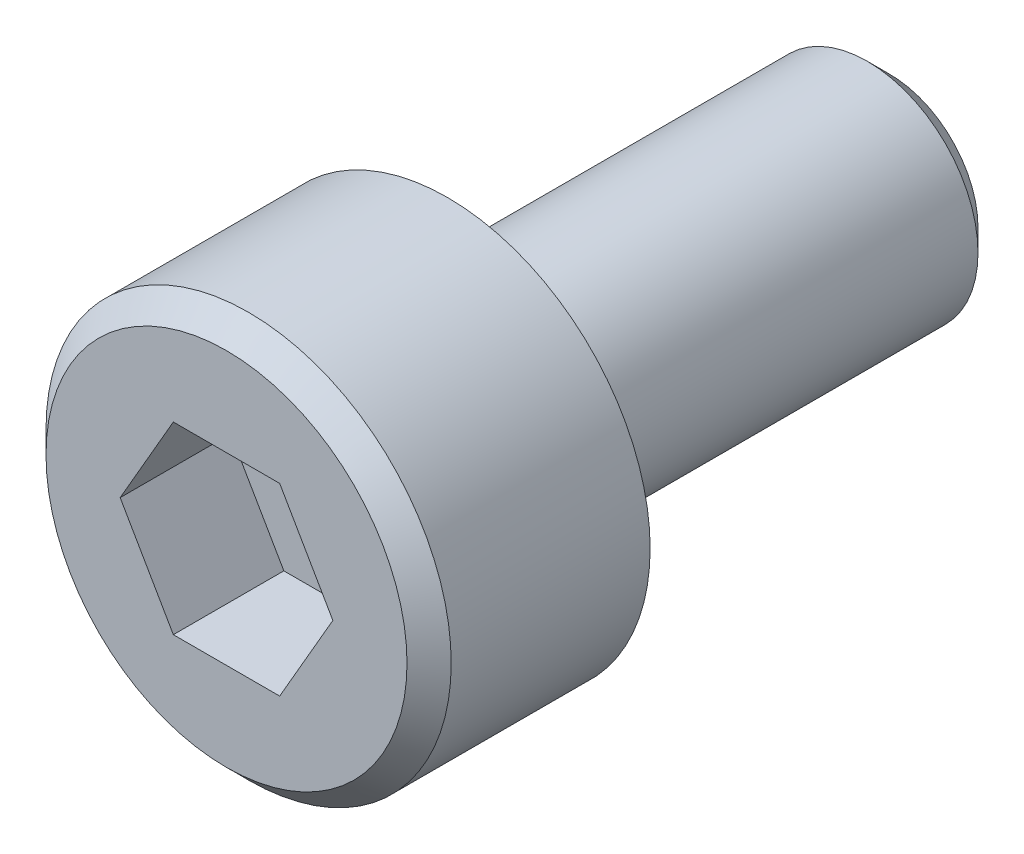
ISO-10303-21;
HEADER;
FILE_DESCRIPTION(('STEP AP214'),'2;1');
FILE_NAME('part.step','',(''),(''),'','','');
FILE_SCHEMA(('AUTOMOTIVE_DESIGN { 1 0 10303 214 1 1 1 1 }'));
ENDSEC;
DATA;
#1=APPLICATION_CONTEXT('core data for automotive mechanical design processes');
#2=APPLICATION_PROTOCOL_DEFINITION('international standard','automotive_design',2000,#1);
#3=PRODUCT_CONTEXT('',#1,'mechanical');
#4=PRODUCT('Part','Part','',(#3));
#5=PRODUCT_RELATED_PRODUCT_CATEGORY('part','',(#4));
#6=PRODUCT_DEFINITION_FORMATION('','',#4);
#7=PRODUCT_DEFINITION_CONTEXT('part definition',#1,'design');
#8=PRODUCT_DEFINITION('design','',#6,#7);
#9=PRODUCT_DEFINITION_SHAPE('','',#8);
#10=(LENGTH_UNIT() NAMED_UNIT(*) SI_UNIT(.MILLI.,.METRE.));
#11=(NAMED_UNIT(*) PLANE_ANGLE_UNIT() SI_UNIT($,.RADIAN.));
#12=(NAMED_UNIT(*) SI_UNIT($,.STERADIAN.) SOLID_ANGLE_UNIT());
#13=UNCERTAINTY_MEASURE_WITH_UNIT(LENGTH_MEASURE(1.E-05),#10,'distance_accuracy_value','');
#14=(GEOMETRIC_REPRESENTATION_CONTEXT(3) GLOBAL_UNCERTAINTY_ASSIGNED_CONTEXT((#13)) GLOBAL_UNIT_ASSIGNED_CONTEXT((#10,
#11,#12)) REPRESENTATION_CONTEXT('',''));
#15=CARTESIAN_POINT('',(0.,0.,0.));
#16=DIRECTION('',(0.,0.,1.));
#17=DIRECTION('',(1.,0.,0.));
#18=AXIS2_PLACEMENT_3D('',#15,#16,#17);
#19=CARTESIAN_POINT('',(0.,0.,-6.));
#20=DIRECTION('',(0.,0.,1.));
#21=DIRECTION('',(1.,0.,0.));
#22=AXIS2_PLACEMENT_3D('',#19,#20,#21);
#23=PLANE('',#22);
#24=CARTESIAN_POINT('',(0.,0.,-6.));
#25=DIRECTION('',(0.,0.,1.));
#26=DIRECTION('',(1.,0.,0.));
#27=AXIS2_PLACEMENT_3D('',#24,#25,#26);
#28=CIRCLE('',#27,1.2);
#29=CARTESIAN_POINT('',(1.2,0.,-6.));
#30=VERTEX_POINT('',#29);
#31=EDGE_CURVE('E11',#30,#30,#28,.T.);
#32=ORIENTED_EDGE('',*,*,#31,.F.);
#33=EDGE_LOOP('',(#32));
#34=FACE_BOUND('',#33,.T.);
#35=ADVANCED_FACE('F16',(#34),#23,.F.);
#36=CARTESIAN_POINT('',(0.,0.,1.5));
#37=DIRECTION('',(0.,0.,1.));
#38=DIRECTION('',(1.,0.,0.));
#39=AXIS2_PLACEMENT_3D('',#36,#37,#38);
#40=PLANE('',#39);
#41=DIRECTION('',(-0.50000000000019,0.866025403784329,0.));
#42=VECTOR('',#41,1.);
#43=CARTESIAN_POINT('',(1.443375679281,0.,1.5));
#44=LINE('',#43,#42);
#45=CARTESIAN_POINT('',(1.443375679281,0.,1.5));
#46=VERTEX_POINT('',#45);
#47=CARTESIAN_POINT('',(0.721687839641,1.250000005462,1.5));
#48=VERTEX_POINT('',#47);
#49=EDGE_CURVE('E25',#46,#48,#44,.T.);
#50=ORIENTED_EDGE('',*,*,#49,.T.);
#51=DIRECTION('',(-1.,0.,0.));
#52=VECTOR('',#51,1.);
#53=CARTESIAN_POINT('',(0.721687839641,1.250000005462,1.5));
#54=LINE('',#53,#52);
#55=CARTESIAN_POINT('',(-0.721687839641,1.250000005462,1.5));
#56=VERTEX_POINT('',#55);
#57=EDGE_CURVE('E110',#48,#56,#54,.T.);
#58=ORIENTED_EDGE('',*,*,#57,.T.);
#59=DIRECTION('',(-0.50000000000019,-0.866025403784329,0.));
#60=VECTOR('',#59,1.);
#61=CARTESIAN_POINT('',(-0.721687839641,1.250000005462,1.5));
#62=LINE('',#61,#60);
#63=CARTESIAN_POINT('',(-1.443375679281,0.,1.5));
#64=VERTEX_POINT('',#63);
#65=EDGE_CURVE('E100',#56,#64,#62,.T.);
#66=ORIENTED_EDGE('',*,*,#65,.T.);
#67=DIRECTION('',(0.50000000000019,-0.866025403784329,0.));
#68=VECTOR('',#67,1.);
#69=CARTESIAN_POINT('',(-1.443375679281,0.,1.5));
#70=LINE('',#69,#68);
#71=CARTESIAN_POINT('',(-0.721687839641,-1.250000005462,1.5));
#72=VERTEX_POINT('',#71);
#73=EDGE_CURVE('E85',#64,#72,#70,.T.);
#74=ORIENTED_EDGE('',*,*,#73,.T.);
#75=DIRECTION('',(1.,0.,0.));
#76=VECTOR('',#75,1.);
#77=CARTESIAN_POINT('',(-0.721687839641,-1.250000005462,1.5));
#78=LINE('',#77,#76);
#79=CARTESIAN_POINT('',(0.721687839641,-1.250000005462,1.5));
#80=VERTEX_POINT('',#79);
#81=EDGE_CURVE('E118',#72,#80,#78,.T.);
#82=ORIENTED_EDGE('',*,*,#81,.T.);
#83=DIRECTION('',(0.50000000000019,0.866025403784329,0.));
#84=VECTOR('',#83,1.);
#85=CARTESIAN_POINT('',(0.721687839641,-1.250000005462,1.5));
#86=LINE('',#85,#84);
#87=EDGE_CURVE('E48',#80,#46,#86,.T.);
#88=ORIENTED_EDGE('',*,*,#87,.T.);
#89=EDGE_LOOP('',(#50,#58,#66,#74,#82,#88));
#90=FACE_BOUND('',#89,.T.);
#91=ADVANCED_FACE('F104',(#90),#40,.T.);
#92=CARTESIAN_POINT('',(0.,0.,-5.7));
#93=DIRECTION('',(0.,0.,1.));
#94=DIRECTION('',(1.,0.,0.));
#95=AXIS2_PLACEMENT_3D('',#92,#93,#94);
#96=CONICAL_SURFACE('',#95,1.5,0.785398163397);
#97=ORIENTED_EDGE('',*,*,#31,.T.);
#98=EDGE_LOOP('',(#97));
#99=FACE_BOUND('',#98,.T.);
#100=CARTESIAN_POINT('',(0.,0.,-5.7));
#101=DIRECTION('',(0.,0.,1.));
#102=DIRECTION('',(1.,0.,0.));
#103=AXIS2_PLACEMENT_3D('',#100,#101,#102);
#104=CIRCLE('',#103,1.5);
#105=CARTESIAN_POINT('',(1.5,0.,-5.7));
#106=VERTEX_POINT('',#105);
#107=EDGE_CURVE('E173',#106,#106,#104,.T.);
#108=ORIENTED_EDGE('',*,*,#107,.F.);
#109=EDGE_LOOP('',(#108));
#110=FACE_BOUND('',#109,.T.);
#111=ADVANCED_FACE('F18',(#99,#110),#96,.T.);
#112=CARTESIAN_POINT('',(1.443375679281,0.,1.5));
#113=DIRECTION('',(-0.866025403784329,-0.50000000000019,0.));
#114=DIRECTION('',(-0.50000000000019,0.866025403784329,0.));
#115=AXIS2_PLACEMENT_3D('',#112,#113,#114);
#116=PLANE('',#115);
#117=ORIENTED_EDGE('',*,*,#49,.F.);
#118=DIRECTION('',(0.,0.,1.));
#119=VECTOR('',#118,1.);
#120=CARTESIAN_POINT('',(1.443375679281,0.,1.5));
#121=LINE('',#120,#119);
#122=CARTESIAN_POINT('',(1.443375679281,0.,3.));
#123=VERTEX_POINT('',#122);
#124=EDGE_CURVE('E130',#46,#123,#121,.T.);
#125=ORIENTED_EDGE('',*,*,#124,.T.);
#126=DIRECTION('',(0.50000000000019,-0.866025403784329,0.));
#127=VECTOR('',#126,1.);
#128=CARTESIAN_POINT('',(1.262953719371,0.312500001366,3.));
#129=LINE('',#128,#127);
#130=CARTESIAN_POINT('',(0.721687839641,1.250000005462,3.));
#131=VERTEX_POINT('',#130);
#132=EDGE_CURVE('E141',#131,#123,#129,.T.);
#133=ORIENTED_EDGE('',*,*,#132,.F.);
#134=DIRECTION('',(0.,0.,1.));
#135=VECTOR('',#134,1.);
#136=CARTESIAN_POINT('',(0.721687839641,1.250000005462,1.5));
#137=LINE('',#136,#135);
#138=EDGE_CURVE('E114',#48,#131,#137,.T.);
#139=ORIENTED_EDGE('',*,*,#138,.F.);
#140=EDGE_LOOP('',(#117,#125,#133,#139));
#141=FACE_BOUND('',#140,.T.);
#142=ADVANCED_FACE('F196',(#141),#116,.T.);
#143=CARTESIAN_POINT('',(0.721687839641,-1.250000005462,1.5));
#144=DIRECTION('',(-0.866025403784329,0.50000000000019,0.));
#145=DIRECTION('',(0.,0.,1.));
#146=AXIS2_PLACEMENT_3D('',#143,#144,#145);
#147=PLANE('',#146);
#148=ORIENTED_EDGE('',*,*,#87,.F.);
#149=DIRECTION('',(0.,0.,1.));
#150=VECTOR('',#149,1.);
#151=CARTESIAN_POINT('',(0.721687839641,-1.250000005462,1.5));
#152=LINE('',#151,#150);
#153=CARTESIAN_POINT('',(0.721687839641,-1.250000005462,3.));
#154=VERTEX_POINT('',#153);
#155=EDGE_CURVE('E121',#80,#154,#152,.T.);
#156=ORIENTED_EDGE('',*,*,#155,.T.);
#157=DIRECTION('',(-0.50000000000019,-0.866025403784329,0.));
#158=VECTOR('',#157,1.);
#159=CARTESIAN_POINT('',(0.902109799551,-0.937500004097,3.));
#160=LINE('',#159,#158);
#161=EDGE_CURVE('E150',#123,#154,#160,.T.);
#162=ORIENTED_EDGE('',*,*,#161,.F.);
#163=ORIENTED_EDGE('',*,*,#124,.F.);
#164=EDGE_LOOP('',(#148,#156,#162,#163));
#165=FACE_BOUND('',#164,.T.);
#166=ADVANCED_FACE('F202',(#165),#147,.T.);
#167=CARTESIAN_POINT('',(-0.721687839641,-1.250000005462,1.5));
#168=DIRECTION('',(0.,1.,0.));
#169=DIRECTION('',(1.,0.,0.));
#170=AXIS2_PLACEMENT_3D('',#167,#168,#169);
#171=PLANE('',#170);
#172=ORIENTED_EDGE('',*,*,#81,.F.);
#173=DIRECTION('',(0.,0.,1.));
#174=VECTOR('',#173,1.);
#175=CARTESIAN_POINT('',(-0.721687839641,-1.250000005462,1.5));
#176=LINE('',#175,#174);
#177=CARTESIAN_POINT('',(-0.721687839641,-1.250000005462,3.));
#178=VERTEX_POINT('',#177);
#179=EDGE_CURVE('E86',#72,#178,#176,.T.);
#180=ORIENTED_EDGE('',*,*,#179,.T.);
#181=DIRECTION('',(-1.,0.,0.));
#182=VECTOR('',#181,1.);
#183=CARTESIAN_POINT('',(-0.36084391982,-1.250000005462,3.));
#184=LINE('',#183,#182);
#185=EDGE_CURVE('E139',#154,#178,#184,.T.);
#186=ORIENTED_EDGE('',*,*,#185,.F.);
#187=ORIENTED_EDGE('',*,*,#155,.F.);
#188=EDGE_LOOP('',(#172,#180,#186,#187));
#189=FACE_BOUND('',#188,.T.);
#190=ADVANCED_FACE('F216',(#189),#171,.T.);
#191=CARTESIAN_POINT('',(-1.443375679281,0.,1.5));
#192=DIRECTION('',(0.866025403784329,0.50000000000019,0.));
#193=DIRECTION('',(0.,0.,-1.));
#194=AXIS2_PLACEMENT_3D('',#191,#192,#193);
#195=PLANE('',#194);
#196=ORIENTED_EDGE('',*,*,#73,.F.);
#197=DIRECTION('',(0.,0.,1.));
#198=VECTOR('',#197,1.);
#199=CARTESIAN_POINT('',(-1.443375679281,0.,1.5));
#200=LINE('',#199,#198);
#201=CARTESIAN_POINT('',(-1.443375679281,0.,3.));
#202=VERTEX_POINT('',#201);
#203=EDGE_CURVE('E88',#64,#202,#200,.T.);
#204=ORIENTED_EDGE('',*,*,#203,.T.);
#205=DIRECTION('',(-0.50000000000019,0.866025403784329,0.));
#206=VECTOR('',#205,1.);
#207=CARTESIAN_POINT('',(-1.262953719371,-0.312500001366,3.));
#208=LINE('',#207,#206);
#209=EDGE_CURVE('E166',#178,#202,#208,.T.);
#210=ORIENTED_EDGE('',*,*,#209,.F.);
#211=ORIENTED_EDGE('',*,*,#179,.F.);
#212=EDGE_LOOP('',(#196,#204,#210,#211));
#213=FACE_BOUND('',#212,.T.);
#214=ADVANCED_FACE('F81',(#213),#195,.T.);
#215=CARTESIAN_POINT('',(-0.721687839641,1.250000005462,1.5));
#216=DIRECTION('',(0.866025403784329,-0.50000000000019,0.));
#217=DIRECTION('',(0.,0.,-1.));
#218=AXIS2_PLACEMENT_3D('',#215,#216,#217);
#219=PLANE('',#218);
#220=ORIENTED_EDGE('',*,*,#65,.F.);
#221=DIRECTION('',(0.,0.,1.));
#222=VECTOR('',#221,1.);
#223=CARTESIAN_POINT('',(-0.721687839641,1.250000005462,1.5));
#224=LINE('',#223,#222);
#225=CARTESIAN_POINT('',(-0.721687839641,1.250000005462,3.));
#226=VERTEX_POINT('',#225);
#227=EDGE_CURVE('E108',#56,#226,#224,.T.);
#228=ORIENTED_EDGE('',*,*,#227,.T.);
#229=DIRECTION('',(0.50000000000019,0.866025403784329,0.));
#230=VECTOR('',#229,1.);
#231=CARTESIAN_POINT('',(-0.902109799551,0.937500004097,3.));
#232=LINE('',#231,#230);
#233=EDGE_CURVE('E99',#202,#226,#232,.T.);
#234=ORIENTED_EDGE('',*,*,#233,.F.);
#235=ORIENTED_EDGE('',*,*,#203,.F.);
#236=EDGE_LOOP('',(#220,#228,#234,#235));
#237=FACE_BOUND('',#236,.T.);
#238=ADVANCED_FACE('F92',(#237),#219,.T.);
#239=CARTESIAN_POINT('',(0.721687839641,1.250000005462,1.5));
#240=DIRECTION('',(0.,-1.,0.));
#241=DIRECTION('',(0.,0.,-1.));
#242=AXIS2_PLACEMENT_3D('',#239,#240,#241);
#243=PLANE('',#242);
#244=ORIENTED_EDGE('',*,*,#57,.F.);
#245=ORIENTED_EDGE('',*,*,#138,.T.);
#246=DIRECTION('',(1.,0.,0.));
#247=VECTOR('',#246,1.);
#248=CARTESIAN_POINT('',(0.36084391982,1.250000005462,3.));
#249=LINE('',#248,#247);
#250=EDGE_CURVE('E146',#226,#131,#249,.T.);
#251=ORIENTED_EDGE('',*,*,#250,.F.);
#252=ORIENTED_EDGE('',*,*,#227,.F.);
#253=EDGE_LOOP('',(#244,#245,#251,#252));
#254=FACE_BOUND('',#253,.T.);
#255=ADVANCED_FACE('F232',(#254),#243,.T.);
#256=CARTESIAN_POINT('',(0.,0.,-6.));
#257=DIRECTION('',(0.,0.,-1.));
#258=DIRECTION('',(1.,0.,0.));
#259=AXIS2_PLACEMENT_3D('',#256,#257,#258);
#260=CYLINDRICAL_SURFACE('',#259,1.5);
#261=CARTESIAN_POINT('',(0.,0.,0.));
#262=DIRECTION('',(0.,0.,1.));
#263=DIRECTION('',(1.,0.,0.));
#264=AXIS2_PLACEMENT_3D('',#261,#262,#263);
#265=CIRCLE('',#264,1.5);
#266=CARTESIAN_POINT('',(1.5,0.,0.));
#267=VERTEX_POINT('',#266);
#268=EDGE_CURVE('E157',#267,#267,#265,.T.);
#269=ORIENTED_EDGE('',*,*,#268,.F.);
#270=EDGE_LOOP('',(#269));
#271=FACE_BOUND('',#270,.T.);
#272=ORIENTED_EDGE('',*,*,#107,.T.);
#273=EDGE_LOOP('',(#272));
#274=FACE_BOUND('',#273,.T.);
#275=ADVANCED_FACE('F193',(#271,#274),#260,.T.);
#276=CARTESIAN_POINT('',(0.,0.,3.));
#277=DIRECTION('',(0.,0.,1.));
#278=DIRECTION('',(1.,0.,0.));
#279=AXIS2_PLACEMENT_3D('',#276,#277,#278);
#280=PLANE('',#279);
#281=ORIENTED_EDGE('',*,*,#250,.T.);
#282=ORIENTED_EDGE('',*,*,#132,.T.);
#283=ORIENTED_EDGE('',*,*,#161,.T.);
#284=ORIENTED_EDGE('',*,*,#185,.T.);
#285=ORIENTED_EDGE('',*,*,#209,.T.);
#286=ORIENTED_EDGE('',*,*,#233,.T.);
#287=EDGE_LOOP('',(#281,#282,#283,#284,#285,#286));
#288=FACE_BOUND('',#287,.T.);
#289=CARTESIAN_POINT('',(0.,0.,3.));
#290=DIRECTION('',(0.,0.,1.));
#291=DIRECTION('',(1.,0.,0.));
#292=AXIS2_PLACEMENT_3D('',#289,#290,#291);
#293=CIRCLE('',#292,2.45);
#294=CARTESIAN_POINT('',(2.45,0.,3.));
#295=VERTEX_POINT('',#294);
#296=EDGE_CURVE('E155',#295,#295,#293,.T.);
#297=ORIENTED_EDGE('',*,*,#296,.T.);
#298=EDGE_LOOP('',(#297));
#299=FACE_BOUND('',#298,.T.);
#300=ADVANCED_FACE('F227',(#288,#299),#280,.T.);
#301=CARTESIAN_POINT('',(0.,0.,0.));
#302=DIRECTION('',(0.,0.,1.));
#303=DIRECTION('',(1.,0.,0.));
#304=AXIS2_PLACEMENT_3D('',#301,#302,#303);
#305=PLANE('',#304);
#306=ORIENTED_EDGE('',*,*,#268,.T.);
#307=EDGE_LOOP('',(#306));
#308=FACE_BOUND('',#307,.T.);
#309=CARTESIAN_POINT('',(0.,0.,0.));
#310=DIRECTION('',(0.,0.,1.));
#311=DIRECTION('',(1.,0.,0.));
#312=AXIS2_PLACEMENT_3D('',#309,#310,#311);
#313=CIRCLE('',#312,2.75);
#314=CARTESIAN_POINT('',(2.75,0.,0.));
#315=VERTEX_POINT('',#314);
#316=EDGE_CURVE('E136',#315,#315,#313,.T.);
#317=ORIENTED_EDGE('',*,*,#316,.F.);
#318=EDGE_LOOP('',(#317));
#319=FACE_BOUND('',#318,.T.);
#320=ADVANCED_FACE('F250',(#308,#319),#305,.F.);
#321=CARTESIAN_POINT('',(0.,0.,2.7));
#322=DIRECTION('',(0.,0.,-1.));
#323=DIRECTION('',(1.,0.,0.));
#324=AXIS2_PLACEMENT_3D('',#321,#322,#323);
#325=CONICAL_SURFACE('',#324,2.75,0.785398163397);
#326=ORIENTED_EDGE('',*,*,#296,.F.);
#327=EDGE_LOOP('',(#326));
#328=FACE_BOUND('',#327,.T.);
#329=CARTESIAN_POINT('',(0.,0.,2.7));
#330=DIRECTION('',(0.,0.,1.));
#331=DIRECTION('',(1.,0.,0.));
#332=AXIS2_PLACEMENT_3D('',#329,#330,#331);
#333=CIRCLE('',#332,2.75);
#334=CARTESIAN_POINT('',(2.75,0.,2.7));
#335=VERTEX_POINT('',#334);
#336=EDGE_CURVE('E142',#335,#335,#333,.T.);
#337=ORIENTED_EDGE('',*,*,#336,.T.);
#338=EDGE_LOOP('',(#337));
#339=FACE_BOUND('',#338,.T.);
#340=ADVANCED_FACE('F246',(#328,#339),#325,.T.);
#341=CARTESIAN_POINT('',(0.,0.,0.));
#342=DIRECTION('',(0.,0.,-1.));
#343=DIRECTION('',(1.,0.,0.));
#344=AXIS2_PLACEMENT_3D('',#341,#342,#343);
#345=CYLINDRICAL_SURFACE('',#344,2.75);
#346=ORIENTED_EDGE('',*,*,#336,.F.);
#347=EDGE_LOOP('',(#346));
#348=FACE_BOUND('',#347,.T.);
#349=ORIENTED_EDGE('',*,*,#316,.T.);
#350=EDGE_LOOP('',(#349));
#351=FACE_BOUND('',#350,.T.);
#352=ADVANCED_FACE('F255',(#348,#351),#345,.T.);
#353=CLOSED_SHELL('',(#35,#91,#111,#142,#166,#190,#214,#238,#255,#275,#300,#320,#340,#352));
#354=MANIFOLD_SOLID_BREP('B1',#353);
#355=ADVANCED_BREP_SHAPE_REPRESENTATION('',(#18,#354),#14);
#356=SHAPE_DEFINITION_REPRESENTATION(#9,#355);
ENDSEC;
END-ISO-10303-21;
